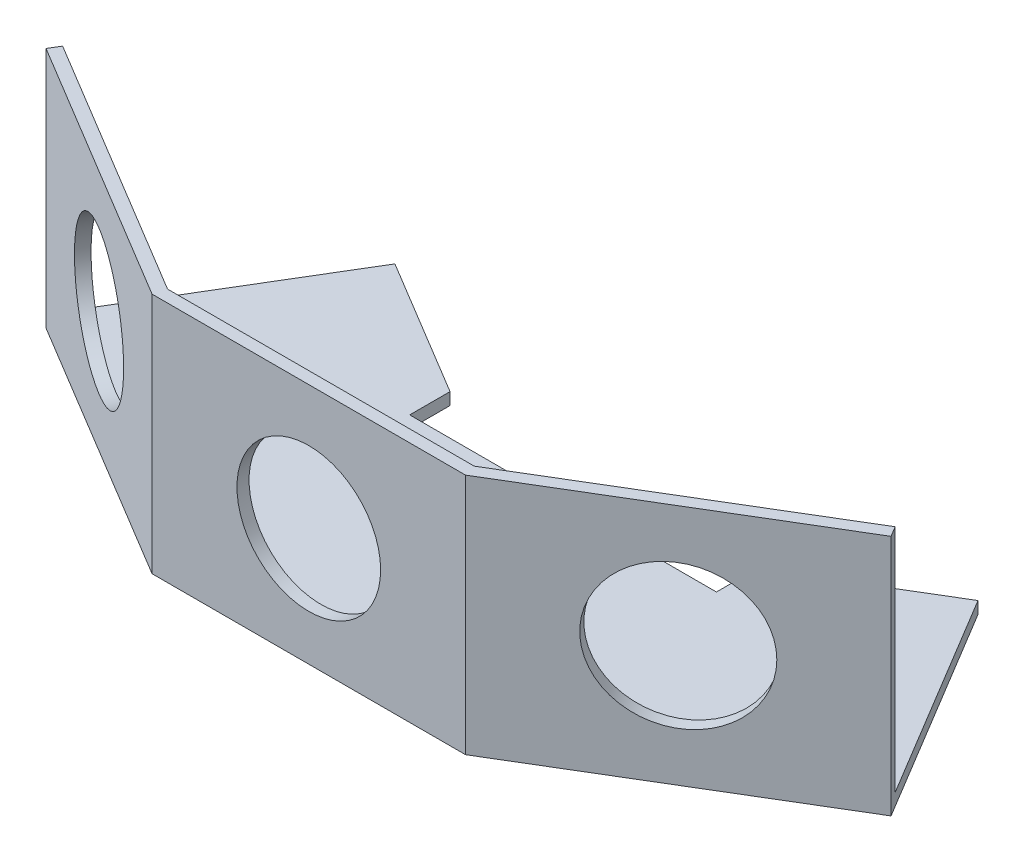
ISO-10303-21;
HEADER;
FILE_DESCRIPTION(('STEP AP214'),'2;1');
FILE_NAME('part.step','',(''),(''),'','','');
FILE_SCHEMA(('AUTOMOTIVE_DESIGN { 1 0 10303 214 1 1 1 1 }'));
ENDSEC;
DATA;
#1=APPLICATION_CONTEXT('core data for automotive mechanical design processes');
#2=APPLICATION_PROTOCOL_DEFINITION('international standard','automotive_design',2000,#1);
#3=PRODUCT_CONTEXT('',#1,'mechanical');
#4=PRODUCT('Part','Part','',(#3));
#5=PRODUCT_RELATED_PRODUCT_CATEGORY('part','',(#4));
#6=PRODUCT_DEFINITION_FORMATION('','',#4);
#7=PRODUCT_DEFINITION_CONTEXT('part definition',#1,'design');
#8=PRODUCT_DEFINITION('design','',#6,#7);
#9=PRODUCT_DEFINITION_SHAPE('','',#8);
#10=(LENGTH_UNIT() NAMED_UNIT(*) SI_UNIT(.MILLI.,.METRE.));
#11=(NAMED_UNIT(*) PLANE_ANGLE_UNIT() SI_UNIT($,.RADIAN.));
#12=(NAMED_UNIT(*) SI_UNIT($,.STERADIAN.) SOLID_ANGLE_UNIT());
#13=UNCERTAINTY_MEASURE_WITH_UNIT(LENGTH_MEASURE(1.E-05),#10,'distance_accuracy_value','');
#14=(GEOMETRIC_REPRESENTATION_CONTEXT(3) GLOBAL_UNCERTAINTY_ASSIGNED_CONTEXT((#13)) GLOBAL_UNIT_ASSIGNED_CONTEXT((#10,
#11,#12)) REPRESENTATION_CONTEXT('',''));
#15=CARTESIAN_POINT('',(0.,0.,0.));
#16=DIRECTION('',(0.,0.,1.));
#17=DIRECTION('',(1.,0.,0.));
#18=AXIS2_PLACEMENT_3D('',#15,#16,#17);
#19=CARTESIAN_POINT('',(-19.,1.5,-20.));
#20=DIRECTION('',(-1.,0.,0.));
#21=DIRECTION('',(0.,0.,1.));
#22=AXIS2_PLACEMENT_3D('',#19,#20,#21);
#23=PLANE('',#22);
#24=DIRECTION('',(0.,0.,-1.));
#25=VECTOR('',#24,1.);
#26=CARTESIAN_POINT('',(-19.,0.,-20.));
#27=LINE('',#26,#25);
#28=CARTESIAN_POINT('',(-19.,0.,-15.));
#29=VERTEX_POINT('',#28);
#30=CARTESIAN_POINT('',(-19.,0.,-20.));
#31=VERTEX_POINT('',#30);
#32=EDGE_CURVE('E144',#29,#31,#27,.T.);
#33=ORIENTED_EDGE('',*,*,#32,.T.);
#34=DIRECTION('',(0.,-1.,0.));
#35=VECTOR('',#34,1.);
#36=CARTESIAN_POINT('',(-19.,1.5,-20.));
#37=LINE('',#36,#35);
#38=CARTESIAN_POINT('',(-19.,1.5,-20.));
#39=VERTEX_POINT('',#38);
#40=EDGE_CURVE('E11',#39,#31,#37,.T.);
#41=ORIENTED_EDGE('',*,*,#40,.F.);
#42=DIRECTION('',(0.,0.,-1.));
#43=VECTOR('',#42,1.);
#44=CARTESIAN_POINT('',(-19.,1.5,-20.));
#45=LINE('',#44,#43);
#46=CARTESIAN_POINT('',(-19.,1.5,-15.));
#47=VERTEX_POINT('',#46);
#48=EDGE_CURVE('E165',#47,#39,#45,.T.);
#49=ORIENTED_EDGE('',*,*,#48,.F.);
#50=DIRECTION('',(0.,-1.,0.));
#51=VECTOR('',#50,1.);
#52=CARTESIAN_POINT('',(-19.,1.5,-15.));
#53=LINE('',#52,#51);
#54=EDGE_CURVE('E140',#47,#29,#53,.T.);
#55=ORIENTED_EDGE('',*,*,#54,.T.);
#56=EDGE_LOOP('',(#33,#41,#49,#55));
#57=FACE_BOUND('',#56,.T.);
#58=ADVANCED_FACE('F39',(#57),#23,.F.);
#59=CARTESIAN_POINT('',(-36.1190659622971,1.5,-30.2872783525188));
#60=DIRECTION('',(-0.515078753637714,0.,0.857142857142856));
#61=DIRECTION('',(0.857142857142856,0.,0.515078753637714));
#62=AXIS2_PLACEMENT_3D('',#59,#60,#61);
#63=PLANE('',#62);
#64=DIRECTION('',(-0.857142857142856,0.,-0.515078753637714));
#65=VECTOR('',#64,1.);
#66=CARTESIAN_POINT('',(-36.1190659622971,0.,-30.2872783525188));
#67=LINE('',#66,#65);
#68=CARTESIAN_POINT('',(-36.1190659622971,0.,-30.2872783525188));
#69=VERTEX_POINT('',#68);
#70=EDGE_CURVE('E148',#31,#69,#67,.T.);
#71=ORIENTED_EDGE('',*,*,#70,.T.);
#72=DIRECTION('',(0.,-1.,0.));
#73=VECTOR('',#72,1.);
#74=CARTESIAN_POINT('',(-36.1190659622971,1.5,-30.2872783525188));
#75=LINE('',#74,#73);
#76=CARTESIAN_POINT('',(-36.1190659622971,1.5,-30.2872783525188));
#77=VERTEX_POINT('',#76);
#78=EDGE_CURVE('E48',#77,#69,#75,.T.);
#79=ORIENTED_EDGE('',*,*,#78,.F.);
#80=DIRECTION('',(-0.857142857142856,0.,-0.515078753637714));
#81=VECTOR('',#80,1.);
#82=CARTESIAN_POINT('',(-36.1190659622971,1.5,-30.2872783525188));
#83=LINE('',#82,#81);
#84=EDGE_CURVE('E94',#39,#77,#83,.T.);
#85=ORIENTED_EDGE('',*,*,#84,.F.);
#86=ORIENTED_EDGE('',*,*,#40,.T.);
#87=EDGE_LOOP('',(#71,#79,#85,#86));
#88=FACE_BOUND('',#87,.T.);
#89=ADVANCED_FACE('F332',(#88),#63,.F.);
#90=CARTESIAN_POINT('',(-51.5714285714285,1.5,-4.57299263823311));
#91=DIRECTION('',(0.857142857142857,0.,0.515078753637713));
#92=DIRECTION('',(0.515078753637713,0.,-0.857142857142857));
#93=AXIS2_PLACEMENT_3D('',#90,#91,#92);
#94=PLANE('',#93);
#95=DIRECTION('',(-0.515078753637713,0.,0.857142857142857));
#96=VECTOR('',#95,1.);
#97=CARTESIAN_POINT('',(-51.5714285714285,0.,-4.57299263823311));
#98=LINE('',#97,#96);
#99=CARTESIAN_POINT('',(-52.3440467018851,0.,-3.28727835251883));
#100=VERTEX_POINT('',#99);
#101=EDGE_CURVE('E152',#69,#100,#98,.T.);
#102=ORIENTED_EDGE('',*,*,#101,.T.);
#103=DIRECTION('',(0.,-1.,0.));
#104=VECTOR('',#103,1.);
#105=CARTESIAN_POINT('',(-52.3440467018851,30.,-3.28727835251883));
#106=LINE('',#105,#104);
#107=CARTESIAN_POINT('',(-52.3440467018851,30.,-3.28727835251883));
#108=VERTEX_POINT('',#107);
#109=EDGE_CURVE('E239',#108,#100,#106,.T.);
#110=ORIENTED_EDGE('',*,*,#109,.F.);
#111=DIRECTION('',(-0.515078753637714,0.,0.857142857142856));
#112=VECTOR('',#111,1.);
#113=CARTESIAN_POINT('',(-51.5714285714285,30.,-4.57299263823311));
#114=LINE('',#113,#112);
#115=CARTESIAN_POINT('',(-51.5714285714285,30.,-4.57299263823311));
#116=VERTEX_POINT('',#115);
#117=EDGE_CURVE('E280',#116,#108,#114,.T.);
#118=ORIENTED_EDGE('',*,*,#117,.F.);
#119=DIRECTION('',(0.,-1.,0.));
#120=VECTOR('',#119,1.);
#121=CARTESIAN_POINT('',(-51.5714285714285,30.,-4.57299263823311));
#122=LINE('',#121,#120);
#123=CARTESIAN_POINT('',(-51.5714285714285,1.5,-4.57299263823311));
#124=VERTEX_POINT('',#123);
#125=EDGE_CURVE('E149',#116,#124,#122,.T.);
#126=ORIENTED_EDGE('',*,*,#125,.T.);
#127=DIRECTION('',(-0.515078753637713,0.,0.857142857142857));
#128=VECTOR('',#127,1.);
#129=CARTESIAN_POINT('',(-51.5714285714285,1.5,-4.57299263823311));
#130=LINE('',#129,#128);
#131=EDGE_CURVE('E181',#77,#124,#130,.T.);
#132=ORIENTED_EDGE('',*,*,#131,.F.);
#133=ORIENTED_EDGE('',*,*,#78,.T.);
#134=EDGE_LOOP('',(#102,#110,#118,#126,#132,#133));
#135=FACE_BOUND('',#134,.T.);
#136=ADVANCED_FACE('F176',(#135),#94,.F.);
#137=CARTESIAN_POINT('',(51.5714285714285,1.5,-4.57299263823313));
#138=DIRECTION('',(-0.857142857142857,0.,0.515078753637713));
#139=DIRECTION('',(0.515078753637713,0.,0.857142857142857));
#140=AXIS2_PLACEMENT_3D('',#137,#138,#139);
#141=PLANE('',#140);
#142=DIRECTION('',(-0.515078753637713,0.,-0.857142857142857));
#143=VECTOR('',#142,1.);
#144=CARTESIAN_POINT('',(51.5714285714285,0.,-4.57299263823313));
#145=LINE('',#144,#143);
#146=CARTESIAN_POINT('',(52.3440467018851,0.,-3.28727835251884));
#147=VERTEX_POINT('',#146);
#148=CARTESIAN_POINT('',(36.1190659622971,0.,-30.2872783525188));
#149=VERTEX_POINT('',#148);
#150=EDGE_CURVE('E156',#147,#149,#145,.T.);
#151=ORIENTED_EDGE('',*,*,#150,.T.);
#152=DIRECTION('',(0.,-1.,0.));
#153=VECTOR('',#152,1.);
#154=CARTESIAN_POINT('',(36.1190659622971,1.5,-30.2872783525188));
#155=LINE('',#154,#153);
#156=CARTESIAN_POINT('',(36.1190659622971,1.5,-30.2872783525188));
#157=VERTEX_POINT('',#156);
#158=EDGE_CURVE('E133',#157,#149,#155,.T.);
#159=ORIENTED_EDGE('',*,*,#158,.F.);
#160=DIRECTION('',(-0.515078753637713,0.,-0.857142857142857));
#161=VECTOR('',#160,1.);
#162=CARTESIAN_POINT('',(51.5714285714285,1.5,-4.57299263823313));
#163=LINE('',#162,#161);
#164=CARTESIAN_POINT('',(51.5714285714285,1.5,-4.57299263823313));
#165=VERTEX_POINT('',#164);
#166=EDGE_CURVE('E122',#165,#157,#163,.T.);
#167=ORIENTED_EDGE('',*,*,#166,.F.);
#168=DIRECTION('',(0.,-1.,0.));
#169=VECTOR('',#168,1.);
#170=CARTESIAN_POINT('',(51.5714285714285,30.,-4.57299263823313));
#171=LINE('',#170,#169);
#172=CARTESIAN_POINT('',(51.5714285714285,30.,-4.57299263823313));
#173=VERTEX_POINT('',#172);
#174=EDGE_CURVE('E224',#173,#165,#171,.T.);
#175=ORIENTED_EDGE('',*,*,#174,.F.);
#176=DIRECTION('',(-0.515078753637711,0.,-0.857142857142858));
#177=VECTOR('',#176,1.);
#178=CARTESIAN_POINT('',(52.3440467018851,30.,-3.28727835251884));
#179=LINE('',#178,#177);
#180=CARTESIAN_POINT('',(52.3440467018851,30.,-3.28727835251884));
#181=VERTEX_POINT('',#180);
#182=EDGE_CURVE('E265',#181,#173,#179,.T.);
#183=ORIENTED_EDGE('',*,*,#182,.F.);
#184=DIRECTION('',(0.,-1.,0.));
#185=VECTOR('',#184,1.);
#186=CARTESIAN_POINT('',(52.3440467018851,30.,-3.28727835251884));
#187=LINE('',#186,#185);
#188=EDGE_CURVE('E228',#181,#147,#187,.T.);
#189=ORIENTED_EDGE('',*,*,#188,.T.);
#190=EDGE_LOOP('',(#151,#159,#167,#175,#183,#189));
#191=FACE_BOUND('',#190,.T.);
#192=ADVANCED_FACE('F347',(#191),#141,.F.);
#193=CARTESIAN_POINT('',(36.1190659622971,1.5,-30.2872783525188));
#194=DIRECTION('',(0.515078753637714,0.,0.857142857142856));
#195=DIRECTION('',(0.857142857142856,0.,-0.515078753637714));
#196=AXIS2_PLACEMENT_3D('',#193,#194,#195);
#197=PLANE('',#196);
#198=DIRECTION('',(-0.857142857142856,0.,0.515078753637714));
#199=VECTOR('',#198,1.);
#200=CARTESIAN_POINT('',(36.1190659622971,0.,-30.2872783525188));
#201=LINE('',#200,#199);
#202=CARTESIAN_POINT('',(19.,0.,-20.));
#203=VERTEX_POINT('',#202);
#204=EDGE_CURVE('E131',#149,#203,#201,.T.);
#205=ORIENTED_EDGE('',*,*,#204,.T.);
#206=DIRECTION('',(0.,-1.,0.));
#207=VECTOR('',#206,1.);
#208=CARTESIAN_POINT('',(19.,1.5,-20.));
#209=LINE('',#208,#207);
#210=CARTESIAN_POINT('',(19.,1.5,-20.));
#211=VERTEX_POINT('',#210);
#212=EDGE_CURVE('E128',#211,#203,#209,.T.);
#213=ORIENTED_EDGE('',*,*,#212,.F.);
#214=DIRECTION('',(-0.857142857142856,0.,0.515078753637714));
#215=VECTOR('',#214,1.);
#216=CARTESIAN_POINT('',(36.1190659622971,1.5,-30.2872783525188));
#217=LINE('',#216,#215);
#218=EDGE_CURVE('E116',#157,#211,#217,.T.);
#219=ORIENTED_EDGE('',*,*,#218,.F.);
#220=ORIENTED_EDGE('',*,*,#158,.T.);
#221=EDGE_LOOP('',(#205,#213,#219,#220));
#222=FACE_BOUND('',#221,.T.);
#223=ADVANCED_FACE('F129',(#222),#197,.F.);
#224=CARTESIAN_POINT('',(19.,1.5,-20.));
#225=DIRECTION('',(1.,0.,0.));
#226=DIRECTION('',(0.,0.,-1.));
#227=AXIS2_PLACEMENT_3D('',#224,#225,#226);
#228=PLANE('',#227);
#229=DIRECTION('',(0.,0.,1.));
#230=VECTOR('',#229,1.);
#231=CARTESIAN_POINT('',(19.,0.,-20.));
#232=LINE('',#231,#230);
#233=CARTESIAN_POINT('',(19.,0.,-15.));
#234=VERTEX_POINT('',#233);
#235=EDGE_CURVE('E80',#203,#234,#232,.T.);
#236=ORIENTED_EDGE('',*,*,#235,.T.);
#237=DIRECTION('',(0.,-1.,0.));
#238=VECTOR('',#237,1.);
#239=CARTESIAN_POINT('',(19.,1.5,-15.));
#240=LINE('',#239,#238);
#241=CARTESIAN_POINT('',(19.,1.5,-15.));
#242=VERTEX_POINT('',#241);
#243=EDGE_CURVE('E134',#242,#234,#240,.T.);
#244=ORIENTED_EDGE('',*,*,#243,.F.);
#245=DIRECTION('',(0.,0.,1.));
#246=VECTOR('',#245,1.);
#247=CARTESIAN_POINT('',(19.,1.5,-20.));
#248=LINE('',#247,#246);
#249=EDGE_CURVE('E120',#211,#242,#248,.T.);
#250=ORIENTED_EDGE('',*,*,#249,.F.);
#251=ORIENTED_EDGE('',*,*,#212,.T.);
#252=EDGE_LOOP('',(#236,#244,#250,#251));
#253=FACE_BOUND('',#252,.T.);
#254=ADVANCED_FACE('F136',(#253),#228,.F.);
#255=CARTESIAN_POINT('',(19.,1.5,-15.));
#256=DIRECTION('',(0.,0.,1.));
#257=DIRECTION('',(1.,0.,0.));
#258=AXIS2_PLACEMENT_3D('',#255,#256,#257);
#259=PLANE('',#258);
#260=DIRECTION('',(-1.,0.,0.));
#261=VECTOR('',#260,1.);
#262=CARTESIAN_POINT('',(19.,0.,-15.));
#263=LINE('',#262,#261);
#264=EDGE_CURVE('E86',#234,#29,#263,.T.);
#265=ORIENTED_EDGE('',*,*,#264,.T.);
#266=ORIENTED_EDGE('',*,*,#54,.F.);
#267=DIRECTION('',(-1.,0.,0.));
#268=VECTOR('',#267,1.);
#269=CARTESIAN_POINT('',(19.,1.5,-15.));
#270=LINE('',#269,#268);
#271=EDGE_CURVE('E56',#242,#47,#270,.T.);
#272=ORIENTED_EDGE('',*,*,#271,.F.);
#273=ORIENTED_EDGE('',*,*,#243,.T.);
#274=EDGE_LOOP('',(#265,#266,#272,#273));
#275=FACE_BOUND('',#274,.T.);
#276=ADVANCED_FACE('F469',(#275),#259,.F.);
#277=CARTESIAN_POINT('',(0.,1.5,0.));
#278=DIRECTION('',(0.,-1.,0.));
#279=DIRECTION('',(0.,0.,-1.));
#280=AXIS2_PLACEMENT_3D('',#277,#278,#279);
#281=PLANE('',#280);
#282=ORIENTED_EDGE('',*,*,#48,.T.);
#283=ORIENTED_EDGE('',*,*,#84,.T.);
#284=ORIENTED_EDGE('',*,*,#131,.T.);
#285=DIRECTION('',(0.857142857142857,0.,0.515078753637714));
#286=VECTOR('',#285,1.);
#287=CARTESIAN_POINT('',(-19.,1.5,15.));
#288=LINE('',#287,#286);
#289=CARTESIAN_POINT('',(-19.,1.5,15.));
#290=VERTEX_POINT('',#289);
#291=EDGE_CURVE('E250',#124,#290,#288,.T.);
#292=ORIENTED_EDGE('',*,*,#291,.T.);
#293=DIRECTION('',(1.,0.,0.));
#294=VECTOR('',#293,1.);
#295=CARTESIAN_POINT('',(19.,1.5,15.));
#296=LINE('',#295,#294);
#297=CARTESIAN_POINT('',(19.,1.5,15.));
#298=VERTEX_POINT('',#297);
#299=EDGE_CURVE('E253',#290,#298,#296,.T.);
#300=ORIENTED_EDGE('',*,*,#299,.T.);
#301=DIRECTION('',(0.857142857142857,0.,-0.515078753637714));
#302=VECTOR('',#301,1.);
#303=CARTESIAN_POINT('',(19.,1.5,15.));
#304=LINE('',#303,#302);
#305=EDGE_CURVE('E256',#298,#165,#304,.T.);
#306=ORIENTED_EDGE('',*,*,#305,.T.);
#307=ORIENTED_EDGE('',*,*,#166,.T.);
#308=ORIENTED_EDGE('',*,*,#218,.T.);
#309=ORIENTED_EDGE('',*,*,#249,.T.);
#310=ORIENTED_EDGE('',*,*,#271,.T.);
#311=EDGE_LOOP('',(#282,#283,#284,#292,#300,#306,#307,#308,#309,#310));
#312=FACE_BOUND('',#311,.T.);
#313=ADVANCED_FACE('F118',(#312),#281,.F.);
#314=CARTESIAN_POINT('',(0.,0.,0.));
#315=DIRECTION('',(0.,-1.,0.));
#316=DIRECTION('',(0.,0.,-1.));
#317=AXIS2_PLACEMENT_3D('',#314,#315,#316);
#318=PLANE('',#317);
#319=ORIENTED_EDGE('',*,*,#150,.F.);
#320=DIRECTION('',(0.857142857142856,0.,-0.515078753637714));
#321=VECTOR('',#320,1.);
#322=CARTESIAN_POINT('',(19.4160251471689,0.,16.5));
#323=LINE('',#322,#321);
#324=CARTESIAN_POINT('',(19.4160251471689,0.,16.5));
#325=VERTEX_POINT('',#324);
#326=EDGE_CURVE('E203',#325,#147,#323,.T.);
#327=ORIENTED_EDGE('',*,*,#326,.F.);
#328=DIRECTION('',(1.,0.,0.));
#329=VECTOR('',#328,1.);
#330=CARTESIAN_POINT('',(-19.4160251471689,0.,16.5));
#331=LINE('',#330,#329);
#332=CARTESIAN_POINT('',(-19.4160251471689,0.,16.5));
#333=VERTEX_POINT('',#332);
#334=EDGE_CURVE('E193',#333,#325,#331,.T.);
#335=ORIENTED_EDGE('',*,*,#334,.F.);
#336=DIRECTION('',(0.857142857142857,0.,0.515078753637714));
#337=VECTOR('',#336,1.);
#338=CARTESIAN_POINT('',(-52.3440467018851,0.,-3.28727835251883));
#339=LINE('',#338,#337);
#340=EDGE_CURVE('E189',#100,#333,#339,.T.);
#341=ORIENTED_EDGE('',*,*,#340,.F.);
#342=ORIENTED_EDGE('',*,*,#101,.F.);
#343=ORIENTED_EDGE('',*,*,#70,.F.);
#344=ORIENTED_EDGE('',*,*,#32,.F.);
#345=ORIENTED_EDGE('',*,*,#264,.F.);
#346=ORIENTED_EDGE('',*,*,#235,.F.);
#347=ORIENTED_EDGE('',*,*,#204,.F.);
#348=EDGE_LOOP('',(#319,#327,#335,#341,#342,#343,#344,#345,#346,#347));
#349=FACE_BOUND('',#348,.T.);
#350=ADVANCED_FACE('F185',(#349),#318,.T.);
#351=CARTESIAN_POINT('',(-51.5714285714285,30.,-4.57299263823311));
#352=DIRECTION('',(-0.515078753637713,0.,0.857142857142857));
#353=DIRECTION('',(0.857142857142857,0.,0.515078753637714));
#354=AXIS2_PLACEMENT_3D('',#351,#352,#353);
#355=PLANE('',#354);
#356=CARTESIAN_POINT('',(-35.1074177940704,15.,5.32064653802631));
#357=DIRECTION('',(-0.515078753637713,0.,0.857142857142857));
#358=DIRECTION('',(0.857142857142857,0.,0.515078753637714));
#359=AXIS2_PLACEMENT_3D('',#356,#357,#358);
#360=CIRCLE('',#359,8.9);
#361=CARTESIAN_POINT('',(-27.478846365499,15.,9.90484744540196));
#362=VERTEX_POINT('',#361);
#363=EDGE_CURVE('E303',#362,#362,#360,.T.);
#364=ORIENTED_EDGE('',*,*,#363,.T.);
#365=EDGE_LOOP('',(#364));
#366=FACE_BOUND('',#365,.T.);
#367=DIRECTION('',(0.,-1.,0.));
#368=VECTOR('',#367,1.);
#369=CARTESIAN_POINT('',(-19.,30.,15.));
#370=LINE('',#369,#368);
#371=CARTESIAN_POINT('',(-19.,30.,15.));
#372=VERTEX_POINT('',#371);
#373=EDGE_CURVE('E216',#372,#290,#370,.T.);
#374=ORIENTED_EDGE('',*,*,#373,.T.);
#375=ORIENTED_EDGE('',*,*,#291,.F.);
#376=ORIENTED_EDGE('',*,*,#125,.F.);
#377=DIRECTION('',(-0.857142857142857,0.,-0.515078753637714));
#378=VECTOR('',#377,1.);
#379=CARTESIAN_POINT('',(-51.5714285714285,30.,-4.57299263823311));
#380=LINE('',#379,#378);
#381=EDGE_CURVE('E215',#372,#116,#380,.T.);
#382=ORIENTED_EDGE('',*,*,#381,.F.);
#383=EDGE_LOOP('',(#374,#375,#376,#382));
#384=FACE_BOUND('',#383,.T.);
#385=ADVANCED_FACE('F372',(#366,#384),#355,.F.);
#386=CARTESIAN_POINT('',(19.,30.,15.));
#387=DIRECTION('',(0.515078753637714,0.,0.857142857142856));
#388=DIRECTION('',(0.857142857142857,0.,-0.515078753637714));
#389=AXIS2_PLACEMENT_3D('',#386,#387,#388);
#390=PLANE('',#389);
#391=CARTESIAN_POINT('',(35.1074177940704,15.,5.3206465380263));
#392=DIRECTION('',(0.515078753637714,0.,0.857142857142856));
#393=DIRECTION('',(0.857142857142857,0.,-0.515078753637714));
#394=AXIS2_PLACEMENT_3D('',#391,#392,#393);
#395=CIRCLE('',#394,8.9);
#396=CARTESIAN_POINT('',(42.7359892226419,15.,0.736445630650642));
#397=VERTEX_POINT('',#396);
#398=EDGE_CURVE('E295',#397,#397,#395,.T.);
#399=ORIENTED_EDGE('',*,*,#398,.T.);
#400=EDGE_LOOP('',(#399));
#401=FACE_BOUND('',#400,.T.);
#402=ORIENTED_EDGE('',*,*,#174,.T.);
#403=ORIENTED_EDGE('',*,*,#305,.F.);
#404=DIRECTION('',(0.,-1.,0.));
#405=VECTOR('',#404,1.);
#406=CARTESIAN_POINT('',(19.,30.,15.));
#407=LINE('',#406,#405);
#408=CARTESIAN_POINT('',(19.,30.,15.));
#409=VERTEX_POINT('',#408);
#410=EDGE_CURVE('E220',#409,#298,#407,.T.);
#411=ORIENTED_EDGE('',*,*,#410,.F.);
#412=DIRECTION('',(-0.857142857142857,0.,0.515078753637714));
#413=VECTOR('',#412,1.);
#414=CARTESIAN_POINT('',(19.,30.,15.));
#415=LINE('',#414,#413);
#416=EDGE_CURVE('E262',#173,#409,#415,.T.);
#417=ORIENTED_EDGE('',*,*,#416,.F.);
#418=EDGE_LOOP('',(#402,#403,#411,#417));
#419=FACE_BOUND('',#418,.T.);
#420=ADVANCED_FACE('F327',(#401,#419),#390,.F.);
#421=CARTESIAN_POINT('',(-19.,30.,15.));
#422=DIRECTION('',(0.,0.,1.));
#423=DIRECTION('',(1.,0.,0.));
#424=AXIS2_PLACEMENT_3D('',#421,#422,#423);
#425=PLANE('',#424);
#426=CARTESIAN_POINT('',(0.,14.5638885967843,15.));
#427=DIRECTION('',(0.,0.,1.));
#428=DIRECTION('',(1.,0.,0.));
#429=AXIS2_PLACEMENT_3D('',#426,#427,#428);
#430=CIRCLE('',#429,8.9);
#431=CARTESIAN_POINT('',(8.9,14.5638885967843,15.));
#432=VERTEX_POINT('',#431);
#433=EDGE_CURVE('E199',#432,#432,#430,.T.);
#434=ORIENTED_EDGE('',*,*,#433,.T.);
#435=EDGE_LOOP('',(#434));
#436=FACE_BOUND('',#435,.T.);
#437=ORIENTED_EDGE('',*,*,#410,.T.);
#438=ORIENTED_EDGE('',*,*,#299,.F.);
#439=ORIENTED_EDGE('',*,*,#373,.F.);
#440=DIRECTION('',(-1.,0.,0.));
#441=VECTOR('',#440,1.);
#442=CARTESIAN_POINT('',(-19.,30.,15.));
#443=LINE('',#442,#441);
#444=EDGE_CURVE('E209',#409,#372,#443,.T.);
#445=ORIENTED_EDGE('',*,*,#444,.F.);
#446=EDGE_LOOP('',(#437,#438,#439,#445));
#447=FACE_BOUND('',#446,.T.);
#448=ADVANCED_FACE('F318',(#436,#447),#425,.F.);
#449=CARTESIAN_POINT('',(-52.3440467018851,30.,-3.28727835251883));
#450=DIRECTION('',(0.515078753637713,0.,-0.857142857142857));
#451=DIRECTION('',(-0.857142857142857,0.,-0.515078753637714));
#452=AXIS2_PLACEMENT_3D('',#449,#450,#451);
#453=PLANE('',#452);
#454=CARTESIAN_POINT('',(-35.880035924527,15.,6.60636082374059));
#455=DIRECTION('',(-0.515078753637714,0.,0.857142857142857));
#456=DIRECTION('',(0.857142857142857,0.,0.515078753637714));
#457=AXIS2_PLACEMENT_3D('',#454,#455,#456);
#458=CIRCLE('',#457,8.9);
#459=CARTESIAN_POINT('',(-28.2514644959556,15.,11.1905617311162));
#460=VERTEX_POINT('',#459);
#461=EDGE_CURVE('E307',#460,#460,#458,.T.);
#462=ORIENTED_EDGE('',*,*,#461,.F.);
#463=EDGE_LOOP('',(#462));
#464=FACE_BOUND('',#463,.T.);
#465=ORIENTED_EDGE('',*,*,#340,.T.);
#466=DIRECTION('',(0.,-1.,0.));
#467=VECTOR('',#466,1.);
#468=CARTESIAN_POINT('',(-19.4160251471689,30.,16.5));
#469=LINE('',#468,#467);
#470=CARTESIAN_POINT('',(-19.4160251471689,30.,16.5));
#471=VERTEX_POINT('',#470);
#472=EDGE_CURVE('E236',#471,#333,#469,.T.);
#473=ORIENTED_EDGE('',*,*,#472,.F.);
#474=DIRECTION('',(0.857142857142857,0.,0.515078753637714));
#475=VECTOR('',#474,1.);
#476=CARTESIAN_POINT('',(-52.3440467018851,30.,-3.28727835251883));
#477=LINE('',#476,#475);
#478=EDGE_CURVE('E276',#108,#471,#477,.T.);
#479=ORIENTED_EDGE('',*,*,#478,.F.);
#480=ORIENTED_EDGE('',*,*,#109,.T.);
#481=EDGE_LOOP('',(#465,#473,#479,#480));
#482=FACE_BOUND('',#481,.T.);
#483=ADVANCED_FACE('F315',(#464,#482),#453,.F.);
#484=CARTESIAN_POINT('',(-19.4160251471689,30.,16.5));
#485=DIRECTION('',(0.,0.,-1.));
#486=DIRECTION('',(-1.,0.,0.));
#487=AXIS2_PLACEMENT_3D('',#484,#485,#486);
#488=PLANE('',#487);
#489=CARTESIAN_POINT('',(0.,14.5638885967843,16.5));
#490=DIRECTION('',(0.,0.,1.));
#491=DIRECTION('',(1.,0.,0.));
#492=AXIS2_PLACEMENT_3D('',#489,#490,#491);
#493=CIRCLE('',#492,8.9);
#494=CARTESIAN_POINT('',(8.9,14.5638885967843,16.5));
#495=VERTEX_POINT('',#494);
#496=EDGE_CURVE('E206',#495,#495,#493,.T.);
#497=ORIENTED_EDGE('',*,*,#496,.F.);
#498=EDGE_LOOP('',(#497));
#499=FACE_BOUND('',#498,.T.);
#500=ORIENTED_EDGE('',*,*,#334,.T.);
#501=DIRECTION('',(0.,-1.,0.));
#502=VECTOR('',#501,1.);
#503=CARTESIAN_POINT('',(19.4160251471689,30.,16.5));
#504=LINE('',#503,#502);
#505=CARTESIAN_POINT('',(19.4160251471689,30.,16.5));
#506=VERTEX_POINT('',#505);
#507=EDGE_CURVE('E232',#506,#325,#504,.T.);
#508=ORIENTED_EDGE('',*,*,#507,.F.);
#509=DIRECTION('',(1.,0.,0.));
#510=VECTOR('',#509,1.);
#511=CARTESIAN_POINT('',(-19.4160251471689,30.,16.5));
#512=LINE('',#511,#510);
#513=EDGE_CURVE('E272',#471,#506,#512,.T.);
#514=ORIENTED_EDGE('',*,*,#513,.F.);
#515=ORIENTED_EDGE('',*,*,#472,.T.);
#516=EDGE_LOOP('',(#500,#508,#514,#515));
#517=FACE_BOUND('',#516,.T.);
#518=ADVANCED_FACE('F317',(#499,#517),#488,.F.);
#519=CARTESIAN_POINT('',(19.4160251471689,30.,16.5));
#520=DIRECTION('',(-0.515078753637714,0.,-0.857142857142856));
#521=DIRECTION('',(-0.857142857142857,0.,0.515078753637714));
#522=AXIS2_PLACEMENT_3D('',#519,#520,#521);
#523=PLANE('',#522);
#524=CARTESIAN_POINT('',(35.880035924527,15.,6.60636082374058));
#525=DIRECTION('',(0.515078753637714,0.,0.857142857142856));
#526=DIRECTION('',(0.857142857142856,0.,-0.515078753637714));
#527=AXIS2_PLACEMENT_3D('',#524,#525,#526);
#528=CIRCLE('',#527,8.9);
#529=CARTESIAN_POINT('',(43.5086073530984,15.,2.02215991636492));
#530=VERTEX_POINT('',#529);
#531=EDGE_CURVE('E299',#530,#530,#528,.T.);
#532=ORIENTED_EDGE('',*,*,#531,.F.);
#533=EDGE_LOOP('',(#532));
#534=FACE_BOUND('',#533,.T.);
#535=ORIENTED_EDGE('',*,*,#326,.T.);
#536=ORIENTED_EDGE('',*,*,#188,.F.);
#537=DIRECTION('',(0.857142857142856,0.,-0.515078753637714));
#538=VECTOR('',#537,1.);
#539=CARTESIAN_POINT('',(19.4160251471689,30.,16.5));
#540=LINE('',#539,#538);
#541=EDGE_CURVE('E268',#506,#181,#540,.T.);
#542=ORIENTED_EDGE('',*,*,#541,.F.);
#543=ORIENTED_EDGE('',*,*,#507,.T.);
#544=EDGE_LOOP('',(#535,#536,#542,#543));
#545=FACE_BOUND('',#544,.T.);
#546=ADVANCED_FACE('F324',(#534,#545),#523,.F.);
#547=CARTESIAN_POINT('',(0.,30.,0.));
#548=DIRECTION('',(0.,-1.,0.));
#549=DIRECTION('',(0.,0.,-1.));
#550=AXIS2_PLACEMENT_3D('',#547,#548,#549);
#551=PLANE('',#550);
#552=ORIENTED_EDGE('',*,*,#381,.T.);
#553=ORIENTED_EDGE('',*,*,#117,.T.);
#554=ORIENTED_EDGE('',*,*,#478,.T.);
#555=ORIENTED_EDGE('',*,*,#513,.T.);
#556=ORIENTED_EDGE('',*,*,#541,.T.);
#557=ORIENTED_EDGE('',*,*,#182,.T.);
#558=ORIENTED_EDGE('',*,*,#416,.T.);
#559=ORIENTED_EDGE('',*,*,#444,.T.);
#560=EDGE_LOOP('',(#552,#553,#554,#555,#556,#557,#558,#559));
#561=FACE_BOUND('',#560,.T.);
#562=ADVANCED_FACE('F353',(#561),#551,.F.);
#563=CARTESIAN_POINT('',(0.,14.5638885967843,-13.5));
#564=DIRECTION('',(0.,0.,1.));
#565=DIRECTION('',(1.,0.,0.));
#566=AXIS2_PLACEMENT_3D('',#563,#564,#565);
#567=CYLINDRICAL_SURFACE('',#566,8.9);
#568=ORIENTED_EDGE('',*,*,#496,.T.);
#569=EDGE_LOOP('',(#568));
#570=FACE_BOUND('',#569,.T.);
#571=ORIENTED_EDGE('',*,*,#433,.F.);
#572=EDGE_LOOP('',(#571));
#573=FACE_BOUND('',#572,.T.);
#574=ADVANCED_FACE('F393',(#570,#573),#567,.F.);
#575=CARTESIAN_POINT('',(20.4276733153956,15.,-19.1079248905451));
#576=DIRECTION('',(0.515078753637714,0.,0.857142857142857));
#577=DIRECTION('',(0.857142857142857,0.,-0.515078753637714));
#578=AXIS2_PLACEMENT_3D('',#575,#576,#577);
#579=CYLINDRICAL_SURFACE('',#578,8.9);
#580=ORIENTED_EDGE('',*,*,#531,.T.);
#581=EDGE_LOOP('',(#580));
#582=FACE_BOUND('',#581,.T.);
#583=ORIENTED_EDGE('',*,*,#398,.F.);
#584=EDGE_LOOP('',(#583));
#585=FACE_BOUND('',#584,.T.);
#586=ADVANCED_FACE('F396',(#582,#585),#579,.F.);
#587=CARTESIAN_POINT('',(-20.4276733153956,15.,-19.1079248905451));
#588=DIRECTION('',(-0.515078753637714,0.,0.857142857142857));
#589=DIRECTION('',(0.857142857142857,0.,0.515078753637714));
#590=AXIS2_PLACEMENT_3D('',#587,#588,#589);
#591=CYLINDRICAL_SURFACE('',#590,8.9);
#592=CARTESIAN_POINT('',(-28.2514644959556,15.,11.1905617311162));
#593=CARTESIAN_POINT('',(-28.24341639043,15.,11.1771688739734));
#594=CARTESIAN_POINT('',(-28.2353682849044,15.,11.1637760168305));
#595=CARTESIAN_POINT('',(-28.2192720738532,15.,11.1369903025448));
#596=CARTESIAN_POINT('',(-28.2112239683276,15.,11.123597445402));
#597=CARTESIAN_POINT('',(-28.1951277572765,15.,11.0968117311162));
#598=CARTESIAN_POINT('',(-28.1870796517509,15.,11.0834188739734));
#599=CARTESIAN_POINT('',(-28.1709834406997,15.,11.0566331596877));
#600=CARTESIAN_POINT('',(-28.1629353351741,15.,11.0432403025448));
#601=CARTESIAN_POINT('',(-28.1468391241229,15.,11.0164545882591));
#602=CARTESIAN_POINT('',(-28.1387910185973,15.,11.0030617311162));
#603=CARTESIAN_POINT('',(-28.1226948075462,15.,10.9762760168305));
#604=CARTESIAN_POINT('',(-28.1146467020206,15.,10.9628831596877));
#605=CARTESIAN_POINT('',(-28.0985504909694,15.,10.936097445402));
#606=CARTESIAN_POINT('',(-28.0905023854438,15.,10.9227045882591));
#607=CARTESIAN_POINT('',(-28.0744061743926,15.,10.8959188739734));
#608=CARTESIAN_POINT('',(-28.066358068867,15.,10.8825260168305));
#609=CARTESIAN_POINT('',(-28.0502618578159,15.,10.8557403025448));
#610=CARTESIAN_POINT('',(-28.0422137522903,15.,10.842347445402));
#611=CARTESIAN_POINT('',(-28.0261175412391,15.,10.8155617311162));
#612=CARTESIAN_POINT('',(-28.0180694357135,15.,10.8021688739734));
#613=CARTESIAN_POINT('',(-28.0019732246623,15.,10.7753831596877));
#614=CARTESIAN_POINT('',(-27.9939251191367,15.,10.7619903025448));
#615=CARTESIAN_POINT('',(-27.9778289080856,15.,10.7352045882591));
#616=CARTESIAN_POINT('',(-27.96978080256,15.,10.7218117311162));
#617=CARTESIAN_POINT('',(-27.9536845915088,15.,10.6950260168305));
#618=CARTESIAN_POINT('',(-27.9456364859832,15.,10.6816331596877));
#619=CARTESIAN_POINT('',(-27.929540274932,15.,10.654847445402));
#620=CARTESIAN_POINT('',(-27.9214921694064,15.,10.6414545882591));
#621=CARTESIAN_POINT('',(-27.9053959583552,15.,10.6146688739734));
#622=CARTESIAN_POINT('',(-27.8973478528297,15.,10.6012760168305));
#623=CARTESIAN_POINT('',(-27.8812516417785,15.,10.5744903025448));
#624=CARTESIAN_POINT('',(-27.8732035362529,15.,10.561097445402));
#625=CARTESIAN_POINT('',(-27.8571073252017,15.,10.5343117311162));
#626=CARTESIAN_POINT('',(-27.8490592196761,15.,10.5209188739734));
#627=CARTESIAN_POINT('',(-27.8329630086249,15.,10.4941331596877));
#628=CARTESIAN_POINT('',(-27.8249149030994,15.,10.4807403025448));
#629=CARTESIAN_POINT('',(-27.8088186920482,15.,10.4539545882591));
#630=CARTESIAN_POINT('',(-27.8007705865226,15.,10.4405617311162));
#631=CARTESIAN_POINT('',(-27.7846743754714,15.,10.4137760168305));
#632=CARTESIAN_POINT('',(-27.7766262699458,15.,10.4003831596877));
#633=CARTESIAN_POINT('',(-27.7605300588946,15.,10.373597445402));
#634=CARTESIAN_POINT('',(-27.752481953369,15.,10.3602045882591));
#635=CARTESIAN_POINT('',(-27.7363857423179,15.,10.3334188739734));
#636=CARTESIAN_POINT('',(-27.7283376367923,15.,10.3200260168305));
#637=CARTESIAN_POINT('',(-27.7122414257411,15.,10.2932403025448));
#638=CARTESIAN_POINT('',(-27.7041933202155,15.,10.279847445402));
#639=CARTESIAN_POINT('',(-27.6880971091643,15.,10.2530617311162));
#640=CARTESIAN_POINT('',(-27.6800490036387,15.,10.2396688739734));
#641=CARTESIAN_POINT('',(-27.6639527925876,15.,10.2128831596877));
#642=CARTESIAN_POINT('',(-27.655904687062,15.,10.1994903025448));
#643=CARTESIAN_POINT('',(-27.6398084760108,15.,10.1727045882591));
#644=CARTESIAN_POINT('',(-27.6317603704852,15.,10.1593117311162));
#645=CARTESIAN_POINT('',(-27.615664159434,15.,10.1325260168305));
#646=CARTESIAN_POINT('',(-27.6076160539084,15.,10.1191331596877));
#647=CARTESIAN_POINT('',(-27.5915198428573,15.,10.092347445402));
#648=CARTESIAN_POINT('',(-27.5834717373317,15.,10.0789545882591));
#649=CARTESIAN_POINT('',(-27.5673755262805,15.,10.0521688739734));
#650=CARTESIAN_POINT('',(-27.5593274207549,15.,10.0387760168305));
#651=CARTESIAN_POINT('',(-27.5432312097037,15.,10.0119903025448));
#652=CARTESIAN_POINT('',(-27.5351831041781,15.,9.99859744540195));
#653=CARTESIAN_POINT('',(-27.519086893127,15.,9.97181173111624));
#654=CARTESIAN_POINT('',(-27.5110387876014,15.,9.95841887397338));
#655=CARTESIAN_POINT('',(-27.4949425765502,15.,9.93163315968767));
#656=CARTESIAN_POINT('',(-27.4868944710246,15.,9.91824030254481));
#657=CARTESIAN_POINT('',(-27.478846365499,15.,9.90484744540196));
#658=B_SPLINE_CURVE_WITH_KNOTS('',3,(#592,#593,#594,#595,#596,#597,#598,#599,#600,#601,#602,
#603,#604,#605,#606,#607,#608,#609,#610,#611,#612,#613,#614,#615,#616,#617,#618,#619,#620,#621,
#622,#623,#624,#625,#626,#627,#628,#629,#630,#631,#632,#633,#634,#635,#636,#637,#638,#639,#640,
#641,#642,#643,#644,#645,#646,#647,#648,#649,#650,#651,#652,#653,#654,#655,#656,#657),
.UNSPECIFIED.,.F.,.F.,(4,2,2,2,2,2,2,2,2,2,2,2,2,2,2,2,2,2,2,2,2,2,2,2,2,2,2,2,2,2,2,2,4),(0.,
0.0468750000000017,0.0937499999999986,0.140624999999996,0.187499999999997,0.234375000000001,
0.281249999999998,0.328124999999999,0.375000000000001,0.421875000000003,0.468750000000001,
0.515624999999998,0.5625,0.609375000000002,0.65625,0.703124999999997,0.749999999999999,0.796875,
0.843749999999999,0.890624999999998,0.9375,0.984375000000001,1.03125,1.078125,1.125,1.171875,
1.21875,1.265625,1.3125,1.359375,1.40625,1.453125,1.5),.UNSPECIFIED.);
#659=EDGE_CURVE('BSEAM312',#460,#362,#658,.T.);
#660=ORIENTED_EDGE('',*,*,#461,.T.);
#661=ORIENTED_EDGE('',*,*,#363,.F.);
#662=ORIENTED_EDGE('',*,*,#659,.T.);
#663=ORIENTED_EDGE('',*,*,#659,.F.);
#664=EDGE_LOOP('',(#660,#662,#661,#663));
#665=FACE_BOUND('',#664,.T.);
#666=ADVANCED_FACE('F312',(#665),#591,.F.);
#667=CLOSED_SHELL('',(#58,#89,#136,#192,#223,#254,#276,#313,#350,#385,#420,#448,#483,#518,#546,
#562,#574,#586,#666));
#668=MANIFOLD_SOLID_BREP('B2',#667);
#669=ADVANCED_BREP_SHAPE_REPRESENTATION('',(#18,#668),#14);
#670=SHAPE_DEFINITION_REPRESENTATION(#9,#669);
ENDSEC;
END-ISO-10303-21;
